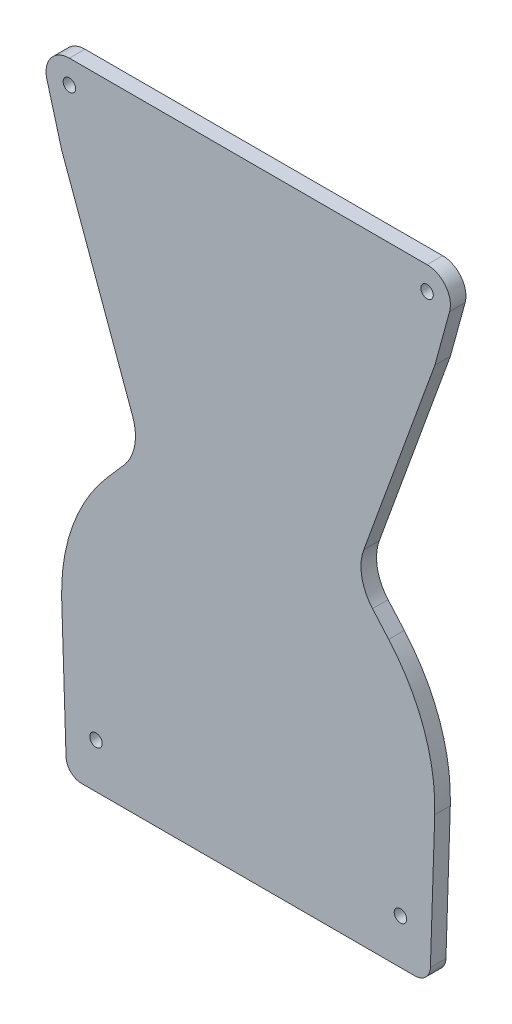
ISO-10303-21;
HEADER;
FILE_DESCRIPTION(('STEP AP214'),'2;1');
FILE_NAME('part.step','',(''),(''),'','','');
FILE_SCHEMA(('AUTOMOTIVE_DESIGN { 1 0 10303 214 1 1 1 1 }'));
ENDSEC;
DATA;
#1=APPLICATION_CONTEXT('core data for automotive mechanical design processes');
#2=APPLICATION_PROTOCOL_DEFINITION('international standard','automotive_design',2000,#1);
#3=PRODUCT_CONTEXT('',#1,'mechanical');
#4=PRODUCT('Part','Part','',(#3));
#5=PRODUCT_RELATED_PRODUCT_CATEGORY('part','',(#4));
#6=PRODUCT_DEFINITION_FORMATION('','',#4);
#7=PRODUCT_DEFINITION_CONTEXT('part definition',#1,'design');
#8=PRODUCT_DEFINITION('design','',#6,#7);
#9=PRODUCT_DEFINITION_SHAPE('','',#8);
#10=(LENGTH_UNIT() NAMED_UNIT(*) SI_UNIT(.MILLI.,.METRE.));
#11=(NAMED_UNIT(*) PLANE_ANGLE_UNIT() SI_UNIT($,.RADIAN.));
#12=(NAMED_UNIT(*) SI_UNIT($,.STERADIAN.) SOLID_ANGLE_UNIT());
#13=UNCERTAINTY_MEASURE_WITH_UNIT(LENGTH_MEASURE(1.E-05),#10,'distance_accuracy_value','');
#14=(GEOMETRIC_REPRESENTATION_CONTEXT(3) GLOBAL_UNCERTAINTY_ASSIGNED_CONTEXT((#13)) GLOBAL_UNIT_ASSIGNED_CONTEXT((#10,
#11,#12)) REPRESENTATION_CONTEXT('',''));
#15=CARTESIAN_POINT('',(0.,0.,0.));
#16=DIRECTION('',(0.,0.,1.));
#17=DIRECTION('',(1.,0.,0.));
#18=AXIS2_PLACEMENT_3D('',#15,#16,#17);
#19=CARTESIAN_POINT('',(-51.2472397666868,5.33165309154084,0.));
#20=DIRECTION('',(0.,0.,1.));
#21=DIRECTION('',(1.,0.,0.));
#22=AXIS2_PLACEMENT_3D('',#19,#20,#21);
#23=PLANE('',#22);
#24=CARTESIAN_POINT('',(-48.9390972440197,-85.598196117635,0.));
#25=DIRECTION('',(0.,0.,1.));
#26=DIRECTION('',(1.,0.,0.));
#27=AXIS2_PLACEMENT_3D('',#24,#25,#26);
#28=CIRCLE('',#27,2.);
#29=CARTESIAN_POINT('',(-46.9390972440197,-85.598196117635,0.));
#30=VERTEX_POINT('',#29);
#31=EDGE_CURVE('E228',#30,#30,#28,.T.);
#32=ORIENTED_EDGE('',*,*,#31,.T.);
#33=EDGE_LOOP('',(#32));
#34=FACE_BOUND('',#33,.T.);
#35=CARTESIAN_POINT('',(48.939097244019,-85.5981961176353,0.));
#36=DIRECTION('',(0.,0.,1.));
#37=DIRECTION('',(1.,0.,0.));
#38=AXIS2_PLACEMENT_3D('',#35,#36,#37);
#39=CIRCLE('',#38,2.);
#40=CARTESIAN_POINT('',(50.939097244019,-85.5981961176353,0.));
#41=VERTEX_POINT('',#40);
#42=EDGE_CURVE('E232',#41,#41,#39,.T.);
#43=ORIENTED_EDGE('',*,*,#42,.T.);
#44=EDGE_LOOP('',(#43));
#45=FACE_BOUND('',#44,.T.);
#46=CARTESIAN_POINT('',(57.5,92.4999999999998,0.));
#47=DIRECTION('',(0.,0.,1.));
#48=DIRECTION('',(1.,0.,0.));
#49=AXIS2_PLACEMENT_3D('',#46,#47,#48);
#50=CIRCLE('',#49,2.);
#51=CARTESIAN_POINT('',(59.5,92.4999999999998,0.));
#52=VERTEX_POINT('',#51);
#53=EDGE_CURVE('E238',#52,#52,#50,.T.);
#54=ORIENTED_EDGE('',*,*,#53,.T.);
#55=EDGE_LOOP('',(#54));
#56=FACE_BOUND('',#55,.T.);
#57=CARTESIAN_POINT('',(-57.5000000000004,92.5,0.));
#58=DIRECTION('',(0.,0.,1.));
#59=DIRECTION('',(1.,0.,0.));
#60=AXIS2_PLACEMENT_3D('',#57,#58,#59);
#61=CIRCLE('',#60,2.);
#62=CARTESIAN_POINT('',(-55.5000000000004,92.5,0.));
#63=VERTEX_POINT('',#62);
#64=EDGE_CURVE('E244',#63,#63,#61,.T.);
#65=ORIENTED_EDGE('',*,*,#64,.T.);
#66=EDGE_LOOP('',(#65));
#67=FACE_BOUND('',#66,.T.);
#68=CARTESIAN_POINT('',(-51.2472397666868,5.33165309154084,0.));
#69=DIRECTION('',(0.,0.,-1.));
#70=DIRECTION('',(1.,0.,0.));
#71=AXIS2_PLACEMENT_3D('',#68,#69,#70);
#72=CIRCLE('',#71,15.);
#73=CARTESIAN_POINT('',(-37.1518504548982,10.4619552414259,0.));
#74=VERTEX_POINT('',#73);
#75=CARTESIAN_POINT('',(-39.9540626596658,-4.54074027731649,0.));
#76=VERTEX_POINT('',#75);
#77=EDGE_CURVE('E250',#74,#76,#72,.T.);
#78=ORIENTED_EDGE('',*,*,#77,.F.);
#79=DIRECTION('',(0.342020143325673,-0.939692620785907,0.));
#80=VECTOR('',#79,1.);
#81=CARTESIAN_POINT('',(-60.0000000000004,73.2367301929159,0.));
#82=LINE('',#81,#80);
#83=CARTESIAN_POINT('',(-60.0000000000004,73.2367301929159,0.));
#84=VERTEX_POINT('',#83);
#85=EDGE_CURVE('E257',#84,#74,#82,.T.);
#86=ORIENTED_EDGE('',*,*,#85,.F.);
#87=DIRECTION('',(0.264171705335057,-0.964475665893322,0.));
#88=VECTOR('',#87,1.);
#89=CARTESIAN_POINT('',(-64.7335674942004,90.5187122099871,0.));
#90=LINE('',#89,#88);
#91=CARTESIAN_POINT('',(-64.7335674942004,90.5187122099871,0.));
#92=VERTEX_POINT('',#91);
#93=EDGE_CURVE('E326',#92,#84,#90,.T.);
#94=ORIENTED_EDGE('',*,*,#93,.F.);
#95=CARTESIAN_POINT('',(-57.5000000000004,92.5,0.));
#96=DIRECTION('',(0.,0.,1.));
#97=DIRECTION('',(1.,0.,0.));
#98=AXIS2_PLACEMENT_3D('',#95,#96,#97);
#99=CIRCLE('',#98,7.50000000000002);
#100=CARTESIAN_POINT('',(-57.5000000000004,100.,0.));
#101=VERTEX_POINT('',#100);
#102=EDGE_CURVE('E324',#101,#92,#99,.T.);
#103=ORIENTED_EDGE('',*,*,#102,.F.);
#104=DIRECTION('',(-1.,0.,0.));
#105=VECTOR('',#104,1.);
#106=CARTESIAN_POINT('',(-57.5000000000004,100.,0.));
#107=LINE('',#106,#105);
#108=CARTESIAN_POINT('',(57.5000000000001,99.9999999999998,0.));
#109=VERTEX_POINT('',#108);
#110=EDGE_CURVE('E322',#109,#101,#107,.T.);
#111=ORIENTED_EDGE('',*,*,#110,.F.);
#112=CARTESIAN_POINT('',(57.5,92.4999999999998,0.));
#113=DIRECTION('',(0.,0.,1.));
#114=DIRECTION('',(1.,0.,0.));
#115=AXIS2_PLACEMENT_3D('',#112,#113,#114);
#116=CIRCLE('',#115,7.49999999999999);
#117=CARTESIAN_POINT('',(64.7335674942,90.5187122099869,0.));
#118=VERTEX_POINT('',#117);
#119=EDGE_CURVE('E319',#118,#109,#116,.T.);
#120=ORIENTED_EDGE('',*,*,#119,.F.);
#121=DIRECTION('',(0.26417170533506,0.964475665893322,0.));
#122=VECTOR('',#121,1.);
#123=CARTESIAN_POINT('',(64.7335674942,90.5187122099869,0.));
#124=LINE('',#123,#122);
#125=CARTESIAN_POINT('',(60.,73.2367301929157,0.));
#126=VERTEX_POINT('',#125);
#127=EDGE_CURVE('E317',#126,#118,#124,.T.);
#128=ORIENTED_EDGE('',*,*,#127,.F.);
#129=DIRECTION('',(0.342020143325676,0.939692620785906,0.));
#130=VECTOR('',#129,1.);
#131=CARTESIAN_POINT('',(60.,73.2367301929157,0.));
#132=LINE('',#131,#130);
#133=CARTESIAN_POINT('',(37.1518504548975,10.4619552414258,0.));
#134=VERTEX_POINT('',#133);
#135=EDGE_CURVE('E315',#134,#126,#132,.T.);
#136=ORIENTED_EDGE('',*,*,#135,.F.);
#137=CARTESIAN_POINT('',(51.2472397666861,5.33165309154064,0.));
#138=DIRECTION('',(0.,0.,-1.));
#139=DIRECTION('',(1.,0.,0.));
#140=AXIS2_PLACEMENT_3D('',#137,#138,#139);
#141=CIRCLE('',#140,15.);
#142=CARTESIAN_POINT('',(39.9540626596651,-4.54074027731666,0.));
#143=VERTEX_POINT('',#142);
#144=EDGE_CURVE('E313',#143,#134,#141,.T.);
#145=ORIENTED_EDGE('',*,*,#144,.F.);
#146=DIRECTION('',(-0.65815955792382,0.752878473801398,0.));
#147=VECTOR('',#146,1.);
#148=CARTESIAN_POINT('',(39.9540626596651,-4.54074027731666,0.));
#149=LINE('',#148,#147);
#150=CARTESIAN_POINT('',(45.1727084280831,-10.5104265245709,0.));
#151=VERTEX_POINT('',#150);
#152=EDGE_CURVE('E311',#151,#143,#149,.T.);
#153=ORIENTED_EDGE('',*,*,#152,.F.);
#154=CARTESIAN_POINT('',(-1.69309011255336E-13,-50.,0.));
#155=DIRECTION('',(0.,0.,1.));
#156=DIRECTION('',(1.,0.,0.));
#157=AXIS2_PLACEMENT_3D('',#154,#155,#156);
#158=CIRCLE('',#157,59.9999999999995);
#159=CARTESIAN_POINT('',(59.9687726914735,-51.9355365866599,0.));
#160=VERTEX_POINT('',#159);
#161=EDGE_CURVE('E309',#160,#151,#158,.T.);
#162=ORIENTED_EDGE('',*,*,#161,.F.);
#163=DIRECTION('',(0.0322589431109976,0.999479544857903,0.));
#164=VECTOR('',#163,1.);
#165=CARTESIAN_POINT('',(58.5736293095166,-95.161294715555,0.));
#166=LINE('',#165,#164);
#167=CARTESIAN_POINT('',(58.5736293095166,-95.161294715555,0.));
#168=VERTEX_POINT('',#167);
#169=EDGE_CURVE('E307',#168,#160,#166,.T.);
#170=ORIENTED_EDGE('',*,*,#169,.F.);
#171=CARTESIAN_POINT('',(53.5762315852271,-95.,0.));
#172=DIRECTION('',(0.,0.,1.));
#173=DIRECTION('',(1.,0.,0.));
#174=AXIS2_PLACEMENT_3D('',#171,#172,#173);
#175=CIRCLE('',#174,5.);
#176=CARTESIAN_POINT('',(53.5762315852271,-100.,0.));
#177=VERTEX_POINT('',#176);
#178=EDGE_CURVE('E305',#177,#168,#175,.T.);
#179=ORIENTED_EDGE('',*,*,#178,.F.);
#180=DIRECTION('',(1.,0.,0.));
#181=VECTOR('',#180,1.);
#182=CARTESIAN_POINT('',(53.5762315852271,-100.,0.));
#183=LINE('',#182,#181);
#184=CARTESIAN_POINT('',(-53.5762315852281,-100.,0.));
#185=VERTEX_POINT('',#184);
#186=EDGE_CURVE('E303',#185,#177,#183,.T.);
#187=ORIENTED_EDGE('',*,*,#186,.F.);
#188=CARTESIAN_POINT('',(-53.5762315852281,-95.,0.));
#189=DIRECTION('',(0.,0.,1.));
#190=DIRECTION('',(1.,0.,0.));
#191=AXIS2_PLACEMENT_3D('',#188,#189,#190);
#192=CIRCLE('',#191,5.);
#193=CARTESIAN_POINT('',(-58.5736293095177,-95.161294715555,0.));
#194=VERTEX_POINT('',#193);
#195=EDGE_CURVE('E300',#194,#185,#192,.T.);
#196=ORIENTED_EDGE('',*,*,#195,.F.);
#197=DIRECTION('',(0.0322589431109939,-0.999479544857903,0.));
#198=VECTOR('',#197,1.);
#199=CARTESIAN_POINT('',(-59.9687726914744,-51.9355365866596,0.));
#200=LINE('',#199,#198);
#201=CARTESIAN_POINT('',(-59.9687726914744,-51.9355365866596,0.));
#202=VERTEX_POINT('',#201);
#203=EDGE_CURVE('E298',#202,#194,#200,.T.);
#204=ORIENTED_EDGE('',*,*,#203,.F.);
#205=CARTESIAN_POINT('',(-1.69309011255336E-13,-50.,0.));
#206=DIRECTION('',(0.,0.,1.));
#207=DIRECTION('',(1.,0.,0.));
#208=AXIS2_PLACEMENT_3D('',#205,#206,#207);
#209=CIRCLE('',#208,60.);
#210=CARTESIAN_POINT('',(-45.1727084280839,-10.5104265245707,0.));
#211=VERTEX_POINT('',#210);
#212=EDGE_CURVE('E296',#211,#202,#209,.T.);
#213=ORIENTED_EDGE('',*,*,#212,.F.);
#214=DIRECTION('',(-0.658159557923822,-0.752878473801396,0.));
#215=VECTOR('',#214,1.);
#216=CARTESIAN_POINT('',(-39.9540626596658,-4.54074027731649,0.));
#217=LINE('',#216,#215);
#218=EDGE_CURVE('E294',#76,#211,#217,.T.);
#219=ORIENTED_EDGE('',*,*,#218,.F.);
#220=EDGE_LOOP('',(#78,#86,#94,#103,#111,#120,#128,#136,#145,#153,#162,#170,#179,#187,#196,#204,
#213,#219));
#221=FACE_BOUND('',#220,.T.);
#222=CARTESIAN_POINT('',(34.1202353646957,2.13266123661626,0.));
#223=DIRECTION('',(0.,0.,1.));
#224=DIRECTION('',(1.,0.,0.));
#225=AXIS2_PLACEMENT_3D('',#222,#223,#224);
#226=CIRCLE('',#225,10.5);
#227=CARTESIAN_POINT('',(24.2534628464436,5.72387274153576,0.));
#228=VERTEX_POINT('',#227);
#229=CARTESIAN_POINT('',(23.7479445238808,0.500000000000013,0.));
#230=VERTEX_POINT('',#229);
#231=EDGE_CURVE('E199',#228,#230,#226,.T.);
#232=ORIENTED_EDGE('',*,*,#231,.F.);
#233=DIRECTION('',(-0.342020143325666,-0.939692620785909,0.));
#234=VECTOR('',#233,1.);
#235=CARTESIAN_POINT('',(25.8705075921699,10.1666666666665,0.));
#236=LINE('',#235,#234);
#237=CARTESIAN_POINT('',(25.8705075921699,10.1666666666665,0.));
#238=VERTEX_POINT('',#237);
#239=EDGE_CURVE('E204',#238,#228,#236,.T.);
#240=ORIENTED_EDGE('',*,*,#239,.F.);
#241=DIRECTION('',(1.,0.,0.));
#242=VECTOR('',#241,1.);
#243=CARTESIAN_POINT('',(25.8705075921699,10.1666666666665,0.));
#244=LINE('',#243,#242);
#245=CARTESIAN_POINT('',(-25.8705075921697,10.1666666666665,0.));
#246=VERTEX_POINT('',#245);
#247=EDGE_CURVE('E217',#246,#238,#244,.T.);
#248=ORIENTED_EDGE('',*,*,#247,.F.);
#249=DIRECTION('',(-0.342020143325673,0.939692620785907,0.));
#250=VECTOR('',#249,1.);
#251=CARTESIAN_POINT('',(-25.8705075921697,10.1666666666665,0.));
#252=LINE('',#251,#250);
#253=CARTESIAN_POINT('',(-24.2534628464435,5.72387274153591,0.));
#254=VERTEX_POINT('',#253);
#255=EDGE_CURVE('E219',#254,#246,#252,.T.);
#256=ORIENTED_EDGE('',*,*,#255,.F.);
#257=CARTESIAN_POINT('',(-34.1202353646955,2.13266123661635,0.));
#258=DIRECTION('',(0.,0.,1.));
#259=DIRECTION('',(-1.,0.,0.));
#260=AXIS2_PLACEMENT_3D('',#257,#258,#259);
#261=CIRCLE('',#260,10.5);
#262=CARTESIAN_POINT('',(-23.7479445238807,0.500000000000013,0.));
#263=VERTEX_POINT('',#262);
#264=EDGE_CURVE('E394',#263,#254,#261,.T.);
#265=ORIENTED_EDGE('',*,*,#264,.F.);
#266=DIRECTION('',(-1.,0.,0.));
#267=VECTOR('',#266,1.);
#268=CARTESIAN_POINT('',(23.7479445238809,0.500000000000013,0.));
#269=LINE('',#268,#267);
#270=EDGE_CURVE('E213',#230,#263,#269,.T.);
#271=ORIENTED_EDGE('',*,*,#270,.F.);
#272=EDGE_LOOP('',(#232,#240,#248,#256,#265,#271));
#273=FACE_BOUND('',#272,.T.);
#274=ADVANCED_FACE('F43',(#34,#45,#56,#67,#221,#273),#23,.F.);
#275=CARTESIAN_POINT('',(-51.2472397666868,5.33165309154084,5.));
#276=DIRECTION('',(0.,0.,1.));
#277=DIRECTION('',(1.,0.,0.));
#278=AXIS2_PLACEMENT_3D('',#275,#276,#277);
#279=PLANE('',#278);
#280=CARTESIAN_POINT('',(48.939097244019,-85.5981961176353,5.));
#281=DIRECTION('',(0.,0.,1.));
#282=DIRECTION('',(1.,0.,0.));
#283=AXIS2_PLACEMENT_3D('',#280,#281,#282);
#284=CIRCLE('',#283,2.);
#285=CARTESIAN_POINT('',(50.939097244019,-85.5981961176353,5.));
#286=VERTEX_POINT('',#285);
#287=EDGE_CURVE('E235',#286,#286,#284,.T.);
#288=ORIENTED_EDGE('',*,*,#287,.F.);
#289=EDGE_LOOP('',(#288));
#290=FACE_BOUND('',#289,.T.);
#291=CARTESIAN_POINT('',(-57.5000000000004,92.5,5.));
#292=DIRECTION('',(0.,0.,1.));
#293=DIRECTION('',(1.,0.,0.));
#294=AXIS2_PLACEMENT_3D('',#291,#292,#293);
#295=CIRCLE('',#294,2.);
#296=CARTESIAN_POINT('',(-55.5000000000004,92.5,5.));
#297=VERTEX_POINT('',#296);
#298=EDGE_CURVE('E247',#297,#297,#295,.T.);
#299=ORIENTED_EDGE('',*,*,#298,.F.);
#300=EDGE_LOOP('',(#299));
#301=FACE_BOUND('',#300,.T.);
#302=CARTESIAN_POINT('',(-51.2472397666868,5.33165309154084,5.));
#303=DIRECTION('',(0.,0.,-1.));
#304=DIRECTION('',(1.,0.,0.));
#305=AXIS2_PLACEMENT_3D('',#302,#303,#304);
#306=CIRCLE('',#305,15.);
#307=CARTESIAN_POINT('',(-37.1518504548982,10.4619552414259,5.));
#308=VERTEX_POINT('',#307);
#309=CARTESIAN_POINT('',(-39.9540626596658,-4.54074027731649,5.));
#310=VERTEX_POINT('',#309);
#311=EDGE_CURVE('E253',#308,#310,#306,.T.);
#312=ORIENTED_EDGE('',*,*,#311,.T.);
#313=DIRECTION('',(-0.658159557923822,-0.752878473801396,0.));
#314=VECTOR('',#313,1.);
#315=CARTESIAN_POINT('',(-39.9540626596658,-4.54074027731649,5.));
#316=LINE('',#315,#314);
#317=CARTESIAN_POINT('',(-45.1727084280839,-10.5104265245707,5.));
#318=VERTEX_POINT('',#317);
#319=EDGE_CURVE('E256',#310,#318,#316,.T.);
#320=ORIENTED_EDGE('',*,*,#319,.T.);
#321=CARTESIAN_POINT('',(-1.69309011255336E-13,-50.,5.));
#322=DIRECTION('',(0.,0.,1.));
#323=DIRECTION('',(1.,0.,0.));
#324=AXIS2_PLACEMENT_3D('',#321,#322,#323);
#325=CIRCLE('',#324,60.);
#326=CARTESIAN_POINT('',(-59.9687726914744,-51.9355365866596,5.));
#327=VERTEX_POINT('',#326);
#328=EDGE_CURVE('E259',#318,#327,#325,.T.);
#329=ORIENTED_EDGE('',*,*,#328,.T.);
#330=DIRECTION('',(0.0322589431109939,-0.999479544857903,0.));
#331=VECTOR('',#330,1.);
#332=CARTESIAN_POINT('',(-59.9687726914744,-51.9355365866596,5.));
#333=LINE('',#332,#331);
#334=CARTESIAN_POINT('',(-58.5736293095177,-95.161294715555,5.));
#335=VERTEX_POINT('',#334);
#336=EDGE_CURVE('E261',#327,#335,#333,.T.);
#337=ORIENTED_EDGE('',*,*,#336,.T.);
#338=CARTESIAN_POINT('',(-53.5762315852281,-95.,5.));
#339=DIRECTION('',(0.,0.,1.));
#340=DIRECTION('',(1.,0.,0.));
#341=AXIS2_PLACEMENT_3D('',#338,#339,#340);
#342=CIRCLE('',#341,5.);
#343=CARTESIAN_POINT('',(-53.5762315852281,-100.,5.));
#344=VERTEX_POINT('',#343);
#345=EDGE_CURVE('E263',#335,#344,#342,.T.);
#346=ORIENTED_EDGE('',*,*,#345,.T.);
#347=DIRECTION('',(1.,0.,0.));
#348=VECTOR('',#347,1.);
#349=CARTESIAN_POINT('',(-50.0000000000004,-100.,5.));
#350=LINE('',#349,#348);
#351=CARTESIAN_POINT('',(53.5762315852271,-100.,5.));
#352=VERTEX_POINT('',#351);
#353=EDGE_CURVE('E265',#344,#352,#350,.T.);
#354=ORIENTED_EDGE('',*,*,#353,.T.);
#355=CARTESIAN_POINT('',(53.5762315852271,-95.,5.));
#356=DIRECTION('',(0.,0.,1.));
#357=DIRECTION('',(1.,0.,0.));
#358=AXIS2_PLACEMENT_3D('',#355,#356,#357);
#359=CIRCLE('',#358,5.);
#360=CARTESIAN_POINT('',(58.5736293095166,-95.161294715555,5.));
#361=VERTEX_POINT('',#360);
#362=EDGE_CURVE('E267',#352,#361,#359,.T.);
#363=ORIENTED_EDGE('',*,*,#362,.T.);
#364=DIRECTION('',(0.0322589431109976,0.999479544857903,0.));
#365=VECTOR('',#364,1.);
#366=CARTESIAN_POINT('',(58.5736293095166,-95.161294715555,5.));
#367=LINE('',#366,#365);
#368=CARTESIAN_POINT('',(59.9687726914735,-51.9355365866599,5.));
#369=VERTEX_POINT('',#368);
#370=EDGE_CURVE('E269',#361,#369,#367,.T.);
#371=ORIENTED_EDGE('',*,*,#370,.T.);
#372=CARTESIAN_POINT('',(-1.69309011255336E-13,-50.,5.));
#373=DIRECTION('',(0.,0.,1.));
#374=DIRECTION('',(1.,0.,0.));
#375=AXIS2_PLACEMENT_3D('',#372,#373,#374);
#376=CIRCLE('',#375,59.9999999999995);
#377=CARTESIAN_POINT('',(45.1727084280831,-10.5104265245709,5.));
#378=VERTEX_POINT('',#377);
#379=EDGE_CURVE('E271',#369,#378,#376,.T.);
#380=ORIENTED_EDGE('',*,*,#379,.T.);
#381=DIRECTION('',(-0.65815955792382,0.752878473801398,0.));
#382=VECTOR('',#381,1.);
#383=CARTESIAN_POINT('',(39.9540626596651,-4.54074027731666,5.));
#384=LINE('',#383,#382);
#385=CARTESIAN_POINT('',(39.9540626596651,-4.54074027731666,5.));
#386=VERTEX_POINT('',#385);
#387=EDGE_CURVE('E273',#378,#386,#384,.T.);
#388=ORIENTED_EDGE('',*,*,#387,.T.);
#389=CARTESIAN_POINT('',(51.2472397666861,5.33165309154064,5.));
#390=DIRECTION('',(0.,0.,-1.));
#391=DIRECTION('',(1.,0.,0.));
#392=AXIS2_PLACEMENT_3D('',#389,#390,#391);
#393=CIRCLE('',#392,15.);
#394=CARTESIAN_POINT('',(37.1518504548975,10.4619552414258,5.));
#395=VERTEX_POINT('',#394);
#396=EDGE_CURVE('E275',#386,#395,#393,.T.);
#397=ORIENTED_EDGE('',*,*,#396,.T.);
#398=DIRECTION('',(0.342020143325676,0.939692620785906,0.));
#399=VECTOR('',#398,1.);
#400=CARTESIAN_POINT('',(60.,73.2367301929157,5.));
#401=LINE('',#400,#399);
#402=CARTESIAN_POINT('',(60.,73.2367301929157,5.));
#403=VERTEX_POINT('',#402);
#404=EDGE_CURVE('E277',#395,#403,#401,.T.);
#405=ORIENTED_EDGE('',*,*,#404,.T.);
#406=DIRECTION('',(0.26417170533506,0.964475665893322,0.));
#407=VECTOR('',#406,1.);
#408=CARTESIAN_POINT('',(64.7335674942,90.5187122099869,5.));
#409=LINE('',#408,#407);
#410=CARTESIAN_POINT('',(64.7335674942,90.5187122099869,5.));
#411=VERTEX_POINT('',#410);
#412=EDGE_CURVE('E279',#403,#411,#409,.T.);
#413=ORIENTED_EDGE('',*,*,#412,.T.);
#414=CARTESIAN_POINT('',(57.5,92.4999999999998,5.));
#415=DIRECTION('',(0.,0.,1.));
#416=DIRECTION('',(1.,0.,0.));
#417=AXIS2_PLACEMENT_3D('',#414,#415,#416);
#418=CIRCLE('',#417,7.49999999999999);
#419=CARTESIAN_POINT('',(57.5000000000001,99.9999999999998,5.));
#420=VERTEX_POINT('',#419);
#421=EDGE_CURVE('E281',#411,#420,#418,.T.);
#422=ORIENTED_EDGE('',*,*,#421,.T.);
#423=DIRECTION('',(-1.,0.,0.));
#424=VECTOR('',#423,1.);
#425=CARTESIAN_POINT('',(54.9999999999999,100.,5.));
#426=LINE('',#425,#424);
#427=CARTESIAN_POINT('',(-57.5000000000004,100.,5.));
#428=VERTEX_POINT('',#427);
#429=EDGE_CURVE('E283',#420,#428,#426,.T.);
#430=ORIENTED_EDGE('',*,*,#429,.T.);
#431=CARTESIAN_POINT('',(-57.5000000000004,92.5,5.));
#432=DIRECTION('',(0.,0.,1.));
#433=DIRECTION('',(1.,0.,0.));
#434=AXIS2_PLACEMENT_3D('',#431,#432,#433);
#435=CIRCLE('',#434,7.50000000000002);
#436=CARTESIAN_POINT('',(-64.7335674942004,90.5187122099871,5.));
#437=VERTEX_POINT('',#436);
#438=EDGE_CURVE('E285',#428,#437,#435,.T.);
#439=ORIENTED_EDGE('',*,*,#438,.T.);
#440=DIRECTION('',(0.264171705335057,-0.964475665893322,0.));
#441=VECTOR('',#440,1.);
#442=CARTESIAN_POINT('',(-64.7335674942004,90.5187122099871,5.));
#443=LINE('',#442,#441);
#444=CARTESIAN_POINT('',(-60.0000000000004,73.2367301929159,5.));
#445=VERTEX_POINT('',#444);
#446=EDGE_CURVE('E287',#437,#445,#443,.T.);
#447=ORIENTED_EDGE('',*,*,#446,.T.);
#448=DIRECTION('',(0.342020143325673,-0.939692620785907,0.));
#449=VECTOR('',#448,1.);
#450=CARTESIAN_POINT('',(-60.0000000000004,73.2367301929159,5.));
#451=LINE('',#450,#449);
#452=EDGE_CURVE('E289',#445,#308,#451,.T.);
#453=ORIENTED_EDGE('',*,*,#452,.T.);
#454=EDGE_LOOP('',(#312,#320,#329,#337,#346,#354,#363,#371,#380,#388,#397,#405,#413,#422,#430,
#439,#447,#453));
#455=FACE_BOUND('',#454,.T.);
#456=CARTESIAN_POINT('',(57.5,92.4999999999998,5.));
#457=DIRECTION('',(0.,0.,1.));
#458=DIRECTION('',(1.,0.,0.));
#459=AXIS2_PLACEMENT_3D('',#456,#457,#458);
#460=CIRCLE('',#459,2.);
#461=CARTESIAN_POINT('',(59.5,92.4999999999998,5.));
#462=VERTEX_POINT('',#461);
#463=EDGE_CURVE('E241',#462,#462,#460,.T.);
#464=ORIENTED_EDGE('',*,*,#463,.F.);
#465=EDGE_LOOP('',(#464));
#466=FACE_BOUND('',#465,.T.);
#467=CARTESIAN_POINT('',(-48.9390972440197,-85.598196117635,5.));
#468=DIRECTION('',(0.,0.,1.));
#469=DIRECTION('',(1.,0.,0.));
#470=AXIS2_PLACEMENT_3D('',#467,#468,#469);
#471=CIRCLE('',#470,2.);
#472=CARTESIAN_POINT('',(-46.9390972440197,-85.598196117635,5.));
#473=VERTEX_POINT('',#472);
#474=EDGE_CURVE('E229',#473,#473,#471,.T.);
#475=ORIENTED_EDGE('',*,*,#474,.F.);
#476=EDGE_LOOP('',(#475));
#477=FACE_BOUND('',#476,.T.);
#478=ADVANCED_FACE('F408',(#290,#301,#455,#466,#477),#279,.T.);
#479=CARTESIAN_POINT('',(-51.2472397666868,5.33165309154084,5.));
#480=DIRECTION('',(0.,0.,-1.));
#481=DIRECTION('',(-1.,0.,0.));
#482=AXIS2_PLACEMENT_3D('',#479,#480,#481);
#483=CYLINDRICAL_SURFACE('',#482,15.);
#484=ORIENTED_EDGE('',*,*,#77,.T.);
#485=DIRECTION('',(0.,0.,-1.));
#486=VECTOR('',#485,1.);
#487=CARTESIAN_POINT('',(-39.9540626596658,-4.54074027731649,5.));
#488=LINE('',#487,#486);
#489=EDGE_CURVE('E379',#310,#76,#488,.T.);
#490=ORIENTED_EDGE('',*,*,#489,.F.);
#491=ORIENTED_EDGE('',*,*,#311,.F.);
#492=DIRECTION('',(0.,0.,-1.));
#493=VECTOR('',#492,1.);
#494=CARTESIAN_POINT('',(-37.1518504548982,10.4619552414259,5.));
#495=LINE('',#494,#493);
#496=EDGE_CURVE('E291',#308,#74,#495,.T.);
#497=ORIENTED_EDGE('',*,*,#496,.T.);
#498=EDGE_LOOP('',(#484,#490,#491,#497));
#499=FACE_BOUND('',#498,.T.);
#500=ADVANCED_FACE('F416',(#499),#483,.F.);
#501=CARTESIAN_POINT('',(-39.9540626596658,-4.54074027731649,5.));
#502=DIRECTION('',(0.752878473801396,-0.658159557923822,0.));
#503=DIRECTION('',(0.658159557923822,0.752878473801396,0.));
#504=AXIS2_PLACEMENT_3D('',#501,#502,#503);
#505=PLANE('',#504);
#506=ORIENTED_EDGE('',*,*,#218,.T.);
#507=DIRECTION('',(0.,0.,-1.));
#508=VECTOR('',#507,1.);
#509=CARTESIAN_POINT('',(-45.1727084280839,-10.5104265245707,5.));
#510=LINE('',#509,#508);
#511=EDGE_CURVE('E376',#318,#211,#510,.T.);
#512=ORIENTED_EDGE('',*,*,#511,.F.);
#513=ORIENTED_EDGE('',*,*,#319,.F.);
#514=ORIENTED_EDGE('',*,*,#489,.T.);
#515=EDGE_LOOP('',(#506,#512,#513,#514));
#516=FACE_BOUND('',#515,.T.);
#517=ADVANCED_FACE('F486',(#516),#505,.F.);
#518=CARTESIAN_POINT('',(-1.69309011255336E-13,-50.,5.));
#519=DIRECTION('',(0.,0.,-1.));
#520=DIRECTION('',(-1.,0.,0.));
#521=AXIS2_PLACEMENT_3D('',#518,#519,#520);
#522=CYLINDRICAL_SURFACE('',#521,60.);
#523=ORIENTED_EDGE('',*,*,#212,.T.);
#524=DIRECTION('',(0.,0.,-1.));
#525=VECTOR('',#524,1.);
#526=CARTESIAN_POINT('',(-59.9687726914744,-51.9355365866596,5.));
#527=LINE('',#526,#525);
#528=EDGE_CURVE('E373',#327,#202,#527,.T.);
#529=ORIENTED_EDGE('',*,*,#528,.F.);
#530=ORIENTED_EDGE('',*,*,#328,.F.);
#531=ORIENTED_EDGE('',*,*,#511,.T.);
#532=EDGE_LOOP('',(#523,#529,#530,#531));
#533=FACE_BOUND('',#532,.T.);
#534=ADVANCED_FACE('F482',(#533),#522,.T.);
#535=CARTESIAN_POINT('',(-59.9687726914744,-51.9355365866596,5.));
#536=DIRECTION('',(0.999479544857903,0.0322589431109939,0.));
#537=DIRECTION('',(-0.0322589431109939,0.999479544857903,0.));
#538=AXIS2_PLACEMENT_3D('',#535,#536,#537);
#539=PLANE('',#538);
#540=ORIENTED_EDGE('',*,*,#203,.T.);
#541=DIRECTION('',(0.,0.,-1.));
#542=VECTOR('',#541,1.);
#543=CARTESIAN_POINT('',(-58.5736293095177,-95.161294715555,5.));
#544=LINE('',#543,#542);
#545=EDGE_CURVE('E370',#335,#194,#544,.T.);
#546=ORIENTED_EDGE('',*,*,#545,.F.);
#547=ORIENTED_EDGE('',*,*,#336,.F.);
#548=ORIENTED_EDGE('',*,*,#528,.T.);
#549=EDGE_LOOP('',(#540,#546,#547,#548));
#550=FACE_BOUND('',#549,.T.);
#551=ADVANCED_FACE('F478',(#550),#539,.F.);
#552=CARTESIAN_POINT('',(-53.5762315852281,-95.,5.));
#553=DIRECTION('',(0.,0.,-1.));
#554=DIRECTION('',(-1.,0.,0.));
#555=AXIS2_PLACEMENT_3D('',#552,#553,#554);
#556=CYLINDRICAL_SURFACE('',#555,5.);
#557=ORIENTED_EDGE('',*,*,#195,.T.);
#558=DIRECTION('',(0.,0.,-1.));
#559=VECTOR('',#558,1.);
#560=CARTESIAN_POINT('',(-53.5762315852281,-100.,5.));
#561=LINE('',#560,#559);
#562=EDGE_CURVE('E367',#344,#185,#561,.T.);
#563=ORIENTED_EDGE('',*,*,#562,.F.);
#564=ORIENTED_EDGE('',*,*,#345,.F.);
#565=ORIENTED_EDGE('',*,*,#545,.T.);
#566=EDGE_LOOP('',(#557,#563,#564,#565));
#567=FACE_BOUND('',#566,.T.);
#568=ADVANCED_FACE('F474',(#567),#556,.T.);
#569=CARTESIAN_POINT('',(53.5762315852271,-100.,5.));
#570=DIRECTION('',(0.,1.,0.));
#571=DIRECTION('',(0.,0.,1.));
#572=AXIS2_PLACEMENT_3D('',#569,#570,#571);
#573=PLANE('',#572);
#574=ORIENTED_EDGE('',*,*,#186,.T.);
#575=DIRECTION('',(0.,0.,-1.));
#576=VECTOR('',#575,1.);
#577=CARTESIAN_POINT('',(53.5762315852271,-100.,5.));
#578=LINE('',#577,#576);
#579=EDGE_CURVE('E364',#352,#177,#578,.T.);
#580=ORIENTED_EDGE('',*,*,#579,.F.);
#581=ORIENTED_EDGE('',*,*,#353,.F.);
#582=ORIENTED_EDGE('',*,*,#562,.T.);
#583=EDGE_LOOP('',(#574,#580,#581,#582));
#584=FACE_BOUND('',#583,.T.);
#585=ADVANCED_FACE('F470',(#584),#573,.F.);
#586=CARTESIAN_POINT('',(53.5762315852271,-95.,5.));
#587=DIRECTION('',(0.,0.,-1.));
#588=DIRECTION('',(-1.,0.,0.));
#589=AXIS2_PLACEMENT_3D('',#586,#587,#588);
#590=CYLINDRICAL_SURFACE('',#589,5.);
#591=ORIENTED_EDGE('',*,*,#178,.T.);
#592=DIRECTION('',(0.,0.,-1.));
#593=VECTOR('',#592,1.);
#594=CARTESIAN_POINT('',(58.5736293095166,-95.161294715555,5.));
#595=LINE('',#594,#593);
#596=EDGE_CURVE('E361',#361,#168,#595,.T.);
#597=ORIENTED_EDGE('',*,*,#596,.F.);
#598=ORIENTED_EDGE('',*,*,#362,.F.);
#599=ORIENTED_EDGE('',*,*,#579,.T.);
#600=EDGE_LOOP('',(#591,#597,#598,#599));
#601=FACE_BOUND('',#600,.T.);
#602=ADVANCED_FACE('F466',(#601),#590,.T.);
#603=CARTESIAN_POINT('',(58.5736293095166,-95.161294715555,5.));
#604=DIRECTION('',(-0.999479544857903,0.0322589431109976,0.));
#605=DIRECTION('',(-0.0322589431109976,-0.999479544857903,0.));
#606=AXIS2_PLACEMENT_3D('',#603,#604,#605);
#607=PLANE('',#606);
#608=ORIENTED_EDGE('',*,*,#169,.T.);
#609=DIRECTION('',(0.,0.,-1.));
#610=VECTOR('',#609,1.);
#611=CARTESIAN_POINT('',(59.9687726914735,-51.9355365866599,5.));
#612=LINE('',#611,#610);
#613=EDGE_CURVE('E358',#369,#160,#612,.T.);
#614=ORIENTED_EDGE('',*,*,#613,.F.);
#615=ORIENTED_EDGE('',*,*,#370,.F.);
#616=ORIENTED_EDGE('',*,*,#596,.T.);
#617=EDGE_LOOP('',(#608,#614,#615,#616));
#618=FACE_BOUND('',#617,.T.);
#619=ADVANCED_FACE('F462',(#618),#607,.F.);
#620=CARTESIAN_POINT('',(-1.69309011255336E-13,-50.,5.));
#621=DIRECTION('',(0.,0.,-1.));
#622=DIRECTION('',(-1.,0.,0.));
#623=AXIS2_PLACEMENT_3D('',#620,#621,#622);
#624=CYLINDRICAL_SURFACE('',#623,59.9999999999995);
#625=ORIENTED_EDGE('',*,*,#161,.T.);
#626=DIRECTION('',(0.,0.,-1.));
#627=VECTOR('',#626,1.);
#628=CARTESIAN_POINT('',(45.1727084280831,-10.5104265245709,5.));
#629=LINE('',#628,#627);
#630=EDGE_CURVE('E355',#378,#151,#629,.T.);
#631=ORIENTED_EDGE('',*,*,#630,.F.);
#632=ORIENTED_EDGE('',*,*,#379,.F.);
#633=ORIENTED_EDGE('',*,*,#613,.T.);
#634=EDGE_LOOP('',(#625,#631,#632,#633));
#635=FACE_BOUND('',#634,.T.);
#636=ADVANCED_FACE('F458',(#635),#624,.T.);
#637=CARTESIAN_POINT('',(39.9540626596651,-4.54074027731666,5.));
#638=DIRECTION('',(-0.752878473801398,-0.65815955792382,0.));
#639=DIRECTION('',(0.65815955792382,-0.752878473801398,0.));
#640=AXIS2_PLACEMENT_3D('',#637,#638,#639);
#641=PLANE('',#640);
#642=ORIENTED_EDGE('',*,*,#152,.T.);
#643=DIRECTION('',(0.,0.,-1.));
#644=VECTOR('',#643,1.);
#645=CARTESIAN_POINT('',(39.9540626596651,-4.54074027731666,5.));
#646=LINE('',#645,#644);
#647=EDGE_CURVE('E352',#386,#143,#646,.T.);
#648=ORIENTED_EDGE('',*,*,#647,.F.);
#649=ORIENTED_EDGE('',*,*,#387,.F.);
#650=ORIENTED_EDGE('',*,*,#630,.T.);
#651=EDGE_LOOP('',(#642,#648,#649,#650));
#652=FACE_BOUND('',#651,.T.);
#653=ADVANCED_FACE('F454',(#652),#641,.F.);
#654=CARTESIAN_POINT('',(51.2472397666861,5.33165309154064,5.));
#655=DIRECTION('',(0.,0.,-1.));
#656=DIRECTION('',(-1.,0.,0.));
#657=AXIS2_PLACEMENT_3D('',#654,#655,#656);
#658=CYLINDRICAL_SURFACE('',#657,15.);
#659=ORIENTED_EDGE('',*,*,#144,.T.);
#660=DIRECTION('',(0.,0.,-1.));
#661=VECTOR('',#660,1.);
#662=CARTESIAN_POINT('',(37.1518504548975,10.4619552414258,5.));
#663=LINE('',#662,#661);
#664=EDGE_CURVE('E349',#395,#134,#663,.T.);
#665=ORIENTED_EDGE('',*,*,#664,.F.);
#666=ORIENTED_EDGE('',*,*,#396,.F.);
#667=ORIENTED_EDGE('',*,*,#647,.T.);
#668=EDGE_LOOP('',(#659,#665,#666,#667));
#669=FACE_BOUND('',#668,.T.);
#670=ADVANCED_FACE('F450',(#669),#658,.F.);
#671=CARTESIAN_POINT('',(60.,73.2367301929157,5.));
#672=DIRECTION('',(-0.939692620785906,0.342020143325676,0.));
#673=DIRECTION('',(-0.342020143325676,-0.939692620785906,0.));
#674=AXIS2_PLACEMENT_3D('',#671,#672,#673);
#675=PLANE('',#674);
#676=ORIENTED_EDGE('',*,*,#135,.T.);
#677=DIRECTION('',(0.,0.,-1.));
#678=VECTOR('',#677,1.);
#679=CARTESIAN_POINT('',(60.,73.2367301929157,5.));
#680=LINE('',#679,#678);
#681=EDGE_CURVE('E346',#403,#126,#680,.T.);
#682=ORIENTED_EDGE('',*,*,#681,.F.);
#683=ORIENTED_EDGE('',*,*,#404,.F.);
#684=ORIENTED_EDGE('',*,*,#664,.T.);
#685=EDGE_LOOP('',(#676,#682,#683,#684));
#686=FACE_BOUND('',#685,.T.);
#687=ADVANCED_FACE('F446',(#686),#675,.F.);
#688=CARTESIAN_POINT('',(64.7335674942,90.5187122099869,5.));
#689=DIRECTION('',(-0.964475665893322,0.26417170533506,0.));
#690=DIRECTION('',(-0.26417170533506,-0.964475665893322,0.));
#691=AXIS2_PLACEMENT_3D('',#688,#689,#690);
#692=PLANE('',#691);
#693=ORIENTED_EDGE('',*,*,#127,.T.);
#694=DIRECTION('',(0.,0.,-1.));
#695=VECTOR('',#694,1.);
#696=CARTESIAN_POINT('',(64.7335674942,90.5187122099869,5.));
#697=LINE('',#696,#695);
#698=EDGE_CURVE('E343',#411,#118,#697,.T.);
#699=ORIENTED_EDGE('',*,*,#698,.F.);
#700=ORIENTED_EDGE('',*,*,#412,.F.);
#701=ORIENTED_EDGE('',*,*,#681,.T.);
#702=EDGE_LOOP('',(#693,#699,#700,#701));
#703=FACE_BOUND('',#702,.T.);
#704=ADVANCED_FACE('F442',(#703),#692,.F.);
#705=CARTESIAN_POINT('',(57.5,92.4999999999998,5.));
#706=DIRECTION('',(0.,0.,-1.));
#707=DIRECTION('',(-1.,0.,0.));
#708=AXIS2_PLACEMENT_3D('',#705,#706,#707);
#709=CYLINDRICAL_SURFACE('',#708,7.49999999999999);
#710=ORIENTED_EDGE('',*,*,#119,.T.);
#711=DIRECTION('',(0.,0.,-1.));
#712=VECTOR('',#711,1.);
#713=CARTESIAN_POINT('',(57.5000000000001,99.9999999999998,5.));
#714=LINE('',#713,#712);
#715=EDGE_CURVE('E340',#420,#109,#714,.T.);
#716=ORIENTED_EDGE('',*,*,#715,.F.);
#717=ORIENTED_EDGE('',*,*,#421,.F.);
#718=ORIENTED_EDGE('',*,*,#698,.T.);
#719=EDGE_LOOP('',(#710,#716,#717,#718));
#720=FACE_BOUND('',#719,.T.);
#721=ADVANCED_FACE('F438',(#720),#709,.T.);
#722=CARTESIAN_POINT('',(-57.5000000000004,100.,5.));
#723=DIRECTION('',(0.,-1.,0.));
#724=DIRECTION('',(0.,0.,-1.));
#725=AXIS2_PLACEMENT_3D('',#722,#723,#724);
#726=PLANE('',#725);
#727=ORIENTED_EDGE('',*,*,#110,.T.);
#728=DIRECTION('',(0.,0.,-1.));
#729=VECTOR('',#728,1.);
#730=CARTESIAN_POINT('',(-57.5000000000004,100.,5.));
#731=LINE('',#730,#729);
#732=EDGE_CURVE('E337',#428,#101,#731,.T.);
#733=ORIENTED_EDGE('',*,*,#732,.F.);
#734=ORIENTED_EDGE('',*,*,#429,.F.);
#735=ORIENTED_EDGE('',*,*,#715,.T.);
#736=EDGE_LOOP('',(#727,#733,#734,#735));
#737=FACE_BOUND('',#736,.T.);
#738=ADVANCED_FACE('F434',(#737),#726,.F.);
#739=CARTESIAN_POINT('',(-57.5000000000004,92.5,5.));
#740=DIRECTION('',(0.,0.,-1.));
#741=DIRECTION('',(-1.,0.,0.));
#742=AXIS2_PLACEMENT_3D('',#739,#740,#741);
#743=CYLINDRICAL_SURFACE('',#742,7.50000000000002);
#744=ORIENTED_EDGE('',*,*,#102,.T.);
#745=DIRECTION('',(0.,0.,-1.));
#746=VECTOR('',#745,1.);
#747=CARTESIAN_POINT('',(-64.7335674942004,90.5187122099871,5.));
#748=LINE('',#747,#746);
#749=EDGE_CURVE('E334',#437,#92,#748,.T.);
#750=ORIENTED_EDGE('',*,*,#749,.F.);
#751=ORIENTED_EDGE('',*,*,#438,.F.);
#752=ORIENTED_EDGE('',*,*,#732,.T.);
#753=EDGE_LOOP('',(#744,#750,#751,#752));
#754=FACE_BOUND('',#753,.T.);
#755=ADVANCED_FACE('F430',(#754),#743,.T.);
#756=CARTESIAN_POINT('',(-64.7335674942004,90.5187122099871,5.));
#757=DIRECTION('',(0.964475665893322,0.264171705335057,0.));
#758=DIRECTION('',(-0.264171705335057,0.964475665893323,0.));
#759=AXIS2_PLACEMENT_3D('',#756,#757,#758);
#760=PLANE('',#759);
#761=ORIENTED_EDGE('',*,*,#93,.T.);
#762=DIRECTION('',(0.,0.,-1.));
#763=VECTOR('',#762,1.);
#764=CARTESIAN_POINT('',(-60.0000000000004,73.2367301929159,5.));
#765=LINE('',#764,#763);
#766=EDGE_CURVE('E331',#445,#84,#765,.T.);
#767=ORIENTED_EDGE('',*,*,#766,.F.);
#768=ORIENTED_EDGE('',*,*,#446,.F.);
#769=ORIENTED_EDGE('',*,*,#749,.T.);
#770=EDGE_LOOP('',(#761,#767,#768,#769));
#771=FACE_BOUND('',#770,.T.);
#772=ADVANCED_FACE('F426',(#771),#760,.F.);
#773=CARTESIAN_POINT('',(-60.0000000000004,73.2367301929159,5.));
#774=DIRECTION('',(0.939692620785907,0.342020143325673,0.));
#775=DIRECTION('',(-0.342020143325673,0.939692620785907,0.));
#776=AXIS2_PLACEMENT_3D('',#773,#774,#775);
#777=PLANE('',#776);
#778=ORIENTED_EDGE('',*,*,#85,.T.);
#779=ORIENTED_EDGE('',*,*,#496,.F.);
#780=ORIENTED_EDGE('',*,*,#452,.F.);
#781=ORIENTED_EDGE('',*,*,#766,.T.);
#782=EDGE_LOOP('',(#778,#779,#780,#781));
#783=FACE_BOUND('',#782,.T.);
#784=ADVANCED_FACE('F422',(#783),#777,.F.);
#785=CARTESIAN_POINT('',(-57.5000000000004,92.5,5.));
#786=DIRECTION('',(0.,0.,-1.));
#787=DIRECTION('',(-1.,0.,0.));
#788=AXIS2_PLACEMENT_3D('',#785,#786,#787);
#789=CYLINDRICAL_SURFACE('',#788,2.);
#790=ORIENTED_EDGE('',*,*,#298,.T.);
#791=EDGE_LOOP('',(#790));
#792=FACE_BOUND('',#791,.T.);
#793=ORIENTED_EDGE('',*,*,#64,.F.);
#794=EDGE_LOOP('',(#793));
#795=FACE_BOUND('',#794,.T.);
#796=ADVANCED_FACE('F425',(#792,#795),#789,.F.);
#797=CARTESIAN_POINT('',(57.5,92.4999999999998,5.));
#798=DIRECTION('',(0.,0.,-1.));
#799=DIRECTION('',(-1.,0.,0.));
#800=AXIS2_PLACEMENT_3D('',#797,#798,#799);
#801=CYLINDRICAL_SURFACE('',#800,2.);
#802=ORIENTED_EDGE('',*,*,#463,.T.);
#803=EDGE_LOOP('',(#802));
#804=FACE_BOUND('',#803,.T.);
#805=ORIENTED_EDGE('',*,*,#53,.F.);
#806=EDGE_LOOP('',(#805));
#807=FACE_BOUND('',#806,.T.);
#808=ADVANCED_FACE('F560',(#804,#807),#801,.F.);
#809=CARTESIAN_POINT('',(48.939097244019,-85.5981961176353,5.));
#810=DIRECTION('',(0.,0.,-1.));
#811=DIRECTION('',(-1.,0.,0.));
#812=AXIS2_PLACEMENT_3D('',#809,#810,#811);
#813=CYLINDRICAL_SURFACE('',#812,2.);
#814=ORIENTED_EDGE('',*,*,#287,.T.);
#815=EDGE_LOOP('',(#814));
#816=FACE_BOUND('',#815,.T.);
#817=ORIENTED_EDGE('',*,*,#42,.F.);
#818=EDGE_LOOP('',(#817));
#819=FACE_BOUND('',#818,.T.);
#820=ADVANCED_FACE('F553',(#816,#819),#813,.F.);
#821=CARTESIAN_POINT('',(-48.9390972440197,-85.598196117635,5.));
#822=DIRECTION('',(0.,0.,-1.));
#823=DIRECTION('',(-1.,0.,0.));
#824=AXIS2_PLACEMENT_3D('',#821,#822,#823);
#825=CYLINDRICAL_SURFACE('',#824,2.);
#826=ORIENTED_EDGE('',*,*,#474,.T.);
#827=EDGE_LOOP('',(#826));
#828=FACE_BOUND('',#827,.T.);
#829=ORIENTED_EDGE('',*,*,#31,.F.);
#830=EDGE_LOOP('',(#829));
#831=FACE_BOUND('',#830,.T.);
#832=ADVANCED_FACE('F551',(#828,#831),#825,.F.);
#833=CARTESIAN_POINT('',(34.1202353646957,2.13266123661626,-10.));
#834=DIRECTION('',(0.,0.,1.));
#835=DIRECTION('',(1.,0.,0.));
#836=AXIS2_PLACEMENT_3D('',#833,#834,#835);
#837=CYLINDRICAL_SURFACE('',#836,10.5);
#838=DIRECTION('',(0.,0.,1.));
#839=VECTOR('',#838,1.);
#840=CARTESIAN_POINT('',(23.7479445238809,0.500000000000013,-10.));
#841=LINE('',#840,#839);
#842=CARTESIAN_POINT('',(23.7479445238809,0.500000000000013,-9.66666666666641));
#843=VERTEX_POINT('',#842);
#844=EDGE_CURVE('E226',#843,#230,#841,.T.);
#845=ORIENTED_EDGE('',*,*,#844,.F.);
#846=CARTESIAN_POINT('',(34.1202353646957,2.13266123661626,-8.03400543005017));
#847=DIRECTION('',(0.,-0.707106781186547,0.707106781186547));
#848=DIRECTION('',(0.,0.707106781186548,0.707106781186548));
#849=AXIS2_PLACEMENT_3D('',#846,#847,#848);
#850=ELLIPSE('',#849,14.8492424049175,10.5);
#851=CARTESIAN_POINT('',(24.2534628464436,5.72387274153576,-4.44279392513066));
#852=VERTEX_POINT('',#851);
#853=EDGE_CURVE('E66',#843,#852,#850,.F.);
#854=ORIENTED_EDGE('',*,*,#853,.T.);
#855=DIRECTION('',(0.,0.,1.));
#856=VECTOR('',#855,1.);
#857=CARTESIAN_POINT('',(24.2534628464436,5.72387274153576,-10.));
#858=LINE('',#857,#856);
#859=EDGE_CURVE('E196',#852,#228,#858,.T.);
#860=ORIENTED_EDGE('',*,*,#859,.T.);
#861=ORIENTED_EDGE('',*,*,#231,.T.);
#862=EDGE_LOOP('',(#845,#854,#860,#861));
#863=FACE_BOUND('',#862,.T.);
#864=ADVANCED_FACE('F198',(#863),#837,.F.);
#865=CARTESIAN_POINT('',(23.7479445238809,0.500000000000013,-10.));
#866=DIRECTION('',(0.,1.,0.));
#867=DIRECTION('',(0.,0.,1.));
#868=AXIS2_PLACEMENT_3D('',#865,#866,#867);
#869=PLANE('',#868);
#870=DIRECTION('',(0.,0.,1.));
#871=VECTOR('',#870,1.);
#872=CARTESIAN_POINT('',(-23.7479445238807,0.500000000000013,-10.));
#873=LINE('',#872,#871);
#874=CARTESIAN_POINT('',(-23.7479445238807,0.500000000000013,-9.66666666666641));
#875=VERTEX_POINT('',#874);
#876=EDGE_CURVE('E224',#875,#263,#873,.T.);
#877=ORIENTED_EDGE('',*,*,#876,.F.);
#878=DIRECTION('',(-1.,0.,0.));
#879=VECTOR('',#878,1.);
#880=CARTESIAN_POINT('',(34.1202353646957,0.500000000000013,-9.66666666666641));
#881=LINE('',#880,#879);
#882=EDGE_CURVE('E382',#875,#843,#881,.F.);
#883=ORIENTED_EDGE('',*,*,#882,.T.);
#884=ORIENTED_EDGE('',*,*,#844,.T.);
#885=ORIENTED_EDGE('',*,*,#270,.T.);
#886=EDGE_LOOP('',(#877,#883,#884,#885));
#887=FACE_BOUND('',#886,.T.);
#888=ADVANCED_FACE('F388',(#887),#869,.F.);
#889=CARTESIAN_POINT('',(-34.1202353646955,2.13266123661635,-10.));
#890=DIRECTION('',(0.,0.,1.));
#891=DIRECTION('',(1.,0.,0.));
#892=AXIS2_PLACEMENT_3D('',#889,#890,#891);
#893=CYLINDRICAL_SURFACE('',#892,10.5);
#894=DIRECTION('',(0.,0.,1.));
#895=VECTOR('',#894,1.);
#896=CARTESIAN_POINT('',(-24.2534628464435,5.72387274153591,-10.));
#897=LINE('',#896,#895);
#898=CARTESIAN_POINT('',(-24.2534628464435,5.72387274153591,-4.44279392513052));
#899=VERTEX_POINT('',#898);
#900=EDGE_CURVE('E203',#899,#254,#897,.T.);
#901=ORIENTED_EDGE('',*,*,#900,.F.);
#902=CARTESIAN_POINT('',(-34.1202353646955,2.13266123661635,-8.03400543005008));
#903=DIRECTION('',(0.,-0.707106781186547,0.707106781186547));
#904=DIRECTION('',(0.,0.707106781186548,0.707106781186548));
#905=AXIS2_PLACEMENT_3D('',#902,#903,#904);
#906=ELLIPSE('',#905,14.8492424049175,10.5);
#907=EDGE_CURVE('E11',#899,#875,#906,.F.);
#908=ORIENTED_EDGE('',*,*,#907,.T.);
#909=ORIENTED_EDGE('',*,*,#876,.T.);
#910=ORIENTED_EDGE('',*,*,#264,.T.);
#911=EDGE_LOOP('',(#901,#908,#909,#910));
#912=FACE_BOUND('',#911,.T.);
#913=ADVANCED_FACE('F398',(#912),#893,.F.);
#914=CARTESIAN_POINT('',(-25.8705075921697,10.1666666666665,-10.));
#915=DIRECTION('',(0.939692620785907,0.342020143325673,0.));
#916=DIRECTION('',(-0.342020143325673,0.939692620785907,0.));
#917=AXIS2_PLACEMENT_3D('',#914,#915,#916);
#918=PLANE('',#917);
#919=ORIENTED_EDGE('',*,*,#255,.T.);
#920=DIRECTION('',(-0.249243569363957,0.684791078771735,0.684791078771735));
#921=VECTOR('',#920,1.);
#922=CARTESIAN_POINT('',(-18.7301457945165,-9.45131613912197,-19.6179828057884));
#923=LINE('',#922,#921);
#924=EDGE_CURVE('E52',#246,#899,#923,.F.);
#925=ORIENTED_EDGE('',*,*,#924,.T.);
#926=ORIENTED_EDGE('',*,*,#900,.T.);
#927=EDGE_LOOP('',(#919,#925,#926));
#928=FACE_BOUND('',#927,.T.);
#929=ADVANCED_FACE('F393',(#928),#918,.F.);
#930=CARTESIAN_POINT('',(25.8705075921699,10.1666666666665,-10.));
#931=DIRECTION('',(-0.939692620785909,0.342020143325666,0.));
#932=DIRECTION('',(-0.342020143325666,-0.939692620785909,0.));
#933=AXIS2_PLACEMENT_3D('',#930,#931,#932);
#934=PLANE('',#933);
#935=ORIENTED_EDGE('',*,*,#859,.F.);
#936=DIRECTION('',(-0.249243569363952,-0.684791078771736,-0.684791078771736));
#937=VECTOR('',#936,1.);
#938=CARTESIAN_POINT('',(22.969404670096,2.19595189675451,-7.97071476991191));
#939=LINE('',#938,#937);
#940=EDGE_CURVE('E216',#852,#238,#939,.F.);
#941=ORIENTED_EDGE('',*,*,#940,.T.);
#942=ORIENTED_EDGE('',*,*,#239,.T.);
#943=EDGE_LOOP('',(#935,#941,#942));
#944=FACE_BOUND('',#943,.T.);
#945=ADVANCED_FACE('F215',(#944),#934,.F.);
#946=CARTESIAN_POINT('',(34.1202353646957,0.166666666666425,-10.));
#947=DIRECTION('',(0.,-0.707106781186547,0.707106781186547));
#948=DIRECTION('',(1.,0.,0.));
#949=AXIS2_PLACEMENT_3D('',#946,#947,#948);
#950=PLANE('',#949);
#951=ORIENTED_EDGE('',*,*,#924,.F.);
#952=ORIENTED_EDGE('',*,*,#247,.T.);
#953=ORIENTED_EDGE('',*,*,#940,.F.);
#954=ORIENTED_EDGE('',*,*,#853,.F.);
#955=ORIENTED_EDGE('',*,*,#882,.F.);
#956=ORIENTED_EDGE('',*,*,#907,.F.);
#957=EDGE_LOOP('',(#951,#952,#953,#954,#955,#956));
#958=FACE_BOUND('',#957,.T.);
#959=ADVANCED_FACE('F46',(#958),#950,.F.);
#960=CLOSED_SHELL('',(#274,#478,#500,#517,#534,#551,#568,#585,#602,#619,#636,#653,#670,#687,
#704,#721,#738,#755,#772,#784,#796,#808,#820,#832,#864,#888,#913,#929,#945,#959));
#961=MANIFOLD_SOLID_BREP('B2',#960);
#962=ADVANCED_BREP_SHAPE_REPRESENTATION('',(#18,#961),#14);
#963=SHAPE_DEFINITION_REPRESENTATION(#9,#962);
ENDSEC;
END-ISO-10303-21;
